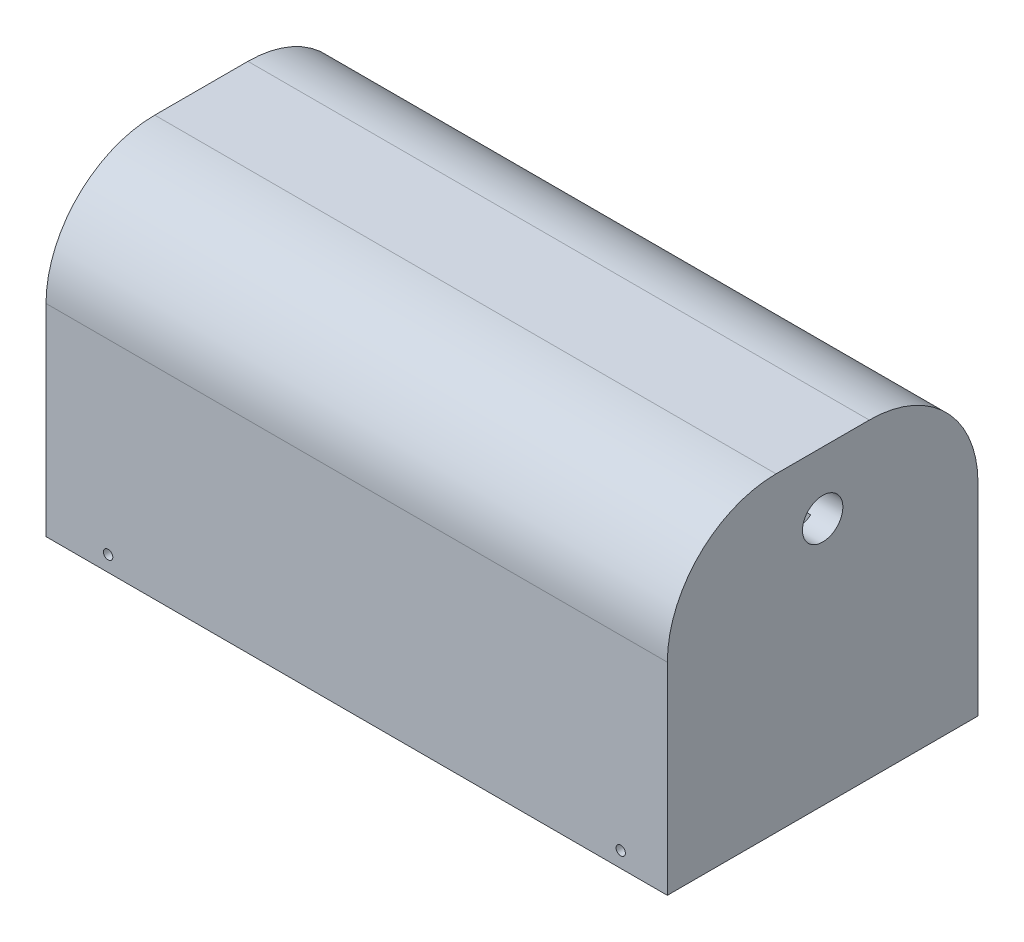
ISO-10303-21;
HEADER;
FILE_DESCRIPTION(('STEP AP214'),'2;1');
FILE_NAME('part.step','',(''),(''),'','','');
FILE_SCHEMA(('AUTOMOTIVE_DESIGN { 1 0 10303 214 1 1 1 1 }'));
ENDSEC;
DATA;
#1=APPLICATION_CONTEXT('core data for automotive mechanical design processes');
#2=APPLICATION_PROTOCOL_DEFINITION('international standard','automotive_design',2000,#1);
#3=PRODUCT_CONTEXT('',#1,'mechanical');
#4=PRODUCT('Part','Part','',(#3));
#5=PRODUCT_RELATED_PRODUCT_CATEGORY('part','',(#4));
#6=PRODUCT_DEFINITION_FORMATION('','',#4);
#7=PRODUCT_DEFINITION_CONTEXT('part definition',#1,'design');
#8=PRODUCT_DEFINITION('design','',#6,#7);
#9=PRODUCT_DEFINITION_SHAPE('','',#8);
#10=(LENGTH_UNIT() NAMED_UNIT(*) SI_UNIT(.MILLI.,.METRE.));
#11=(NAMED_UNIT(*) PLANE_ANGLE_UNIT() SI_UNIT($,.RADIAN.));
#12=(NAMED_UNIT(*) SI_UNIT($,.STERADIAN.) SOLID_ANGLE_UNIT());
#13=UNCERTAINTY_MEASURE_WITH_UNIT(LENGTH_MEASURE(1.E-05),#10,'distance_accuracy_value','');
#14=(GEOMETRIC_REPRESENTATION_CONTEXT(3) GLOBAL_UNCERTAINTY_ASSIGNED_CONTEXT((#13)) GLOBAL_UNIT_ASSIGNED_CONTEXT((#10,
#11,#12)) REPRESENTATION_CONTEXT('',''));
#15=CARTESIAN_POINT('',(0.,0.,0.));
#16=DIRECTION('',(0.,0.,1.));
#17=DIRECTION('',(1.,0.,0.));
#18=AXIS2_PLACEMENT_3D('',#15,#16,#17);
#19=CARTESIAN_POINT('',(92.,25.,8.));
#20=DIRECTION('',(1.,0.,0.));
#21=DIRECTION('',(0.,1.,0.));
#22=AXIS2_PLACEMENT_3D('',#19,#20,#21);
#23=PLANE('',#22);
#24=DIRECTION('',(0.,0.,-1.));
#25=VECTOR('',#24,1.);
#26=CARTESIAN_POINT('',(92.,-42.,8.));
#27=LINE('',#26,#25);
#28=CARTESIAN_POINT('',(92.,-42.,92.));
#29=VERTEX_POINT('',#28);
#30=CARTESIAN_POINT('',(92.,-42.,8.));
#31=VERTEX_POINT('',#30);
#32=EDGE_CURVE('E200',#29,#31,#27,.T.);
#33=ORIENTED_EDGE('',*,*,#32,.F.);
#34=DIRECTION('',(0.,-1.,0.));
#35=VECTOR('',#34,1.);
#36=CARTESIAN_POINT('',(92.,25.,92.));
#37=LINE('',#36,#35);
#38=CARTESIAN_POINT('',(92.,25.,92.));
#39=VERTEX_POINT('',#38);
#40=EDGE_CURVE('E227',#39,#29,#37,.T.);
#41=ORIENTED_EDGE('',*,*,#40,.F.);
#42=DIRECTION('',(0.,0.,1.));
#43=VECTOR('',#42,1.);
#44=CARTESIAN_POINT('',(92.,25.,8.));
#45=LINE('',#44,#43);
#46=CARTESIAN_POINT('',(92.,25.,54.153311931459));
#47=VERTEX_POINT('',#46);
#48=EDGE_CURVE('E214',#47,#39,#45,.T.);
#49=ORIENTED_EDGE('',*,*,#48,.F.);
#50=CARTESIAN_POINT('',(92.,30.,50.));
#51=DIRECTION('',(1.,0.,0.));
#52=DIRECTION('',(0.,1.,0.));
#53=AXIS2_PLACEMENT_3D('',#50,#51,#52);
#54=CIRCLE('',#53,6.5);
#55=CARTESIAN_POINT('',(92.,25.,45.846688068541));
#56=VERTEX_POINT('',#55);
#57=EDGE_CURVE('E286',#56,#47,#54,.F.);
#58=ORIENTED_EDGE('',*,*,#57,.F.);
#59=CARTESIAN_POINT('',(92.,25.,8.));
#60=VERTEX_POINT('',#59);
#61=EDGE_CURVE('E215',#60,#56,#45,.T.);
#62=ORIENTED_EDGE('',*,*,#61,.F.);
#63=DIRECTION('',(0.,-1.,0.));
#64=VECTOR('',#63,1.);
#65=CARTESIAN_POINT('',(92.,25.,8.));
#66=LINE('',#65,#64);
#67=EDGE_CURVE('E228',#60,#31,#66,.T.);
#68=ORIENTED_EDGE('',*,*,#67,.T.);
#69=EDGE_LOOP('',(#33,#41,#49,#58,#62,#68));
#70=FACE_BOUND('',#69,.T.);
#71=ADVANCED_FACE('F37',(#70),#23,.F.);
#72=CARTESIAN_POINT('',(-92.,25.,7.99999999999998));
#73=DIRECTION('',(-1.,0.,0.));
#74=DIRECTION('',(0.,-1.,0.));
#75=AXIS2_PLACEMENT_3D('',#72,#73,#74);
#76=PLANE('',#75);
#77=DIRECTION('',(0.,0.,1.));
#78=VECTOR('',#77,1.);
#79=CARTESIAN_POINT('',(-92.,-42.,7.99999999999998));
#80=LINE('',#79,#78);
#81=CARTESIAN_POINT('',(-92.,-42.,7.99999999999998));
#82=VERTEX_POINT('',#81);
#83=CARTESIAN_POINT('',(-92.,-42.,92.));
#84=VERTEX_POINT('',#83);
#85=EDGE_CURVE('E195',#82,#84,#80,.T.);
#86=ORIENTED_EDGE('',*,*,#85,.F.);
#87=DIRECTION('',(0.,-1.,0.));
#88=VECTOR('',#87,1.);
#89=CARTESIAN_POINT('',(-92.,25.,7.99999999999998));
#90=LINE('',#89,#88);
#91=CARTESIAN_POINT('',(-92.,25.,7.99999999999998));
#92=VERTEX_POINT('',#91);
#93=EDGE_CURVE('E232',#92,#82,#90,.T.);
#94=ORIENTED_EDGE('',*,*,#93,.F.);
#95=DIRECTION('',(0.,0.,-1.));
#96=VECTOR('',#95,1.);
#97=CARTESIAN_POINT('',(-92.,25.,7.99999999999998));
#98=LINE('',#97,#96);
#99=CARTESIAN_POINT('',(-92.,25.,45.846688068541));
#100=VERTEX_POINT('',#99);
#101=EDGE_CURVE('E221',#100,#92,#98,.T.);
#102=ORIENTED_EDGE('',*,*,#101,.F.);
#103=CARTESIAN_POINT('',(-92.,30.,50.));
#104=DIRECTION('',(-1.,0.,0.));
#105=DIRECTION('',(0.,-1.,0.));
#106=AXIS2_PLACEMENT_3D('',#103,#104,#105);
#107=CIRCLE('',#106,6.5);
#108=CARTESIAN_POINT('',(-92.,25.,54.153311931459));
#109=VERTEX_POINT('',#108);
#110=EDGE_CURVE('E283',#109,#100,#107,.F.);
#111=ORIENTED_EDGE('',*,*,#110,.F.);
#112=CARTESIAN_POINT('',(-92.,25.,92.));
#113=VERTEX_POINT('',#112);
#114=EDGE_CURVE('E222',#113,#109,#98,.T.);
#115=ORIENTED_EDGE('',*,*,#114,.F.);
#116=DIRECTION('',(0.,-1.,0.));
#117=VECTOR('',#116,1.);
#118=CARTESIAN_POINT('',(-92.,25.,92.));
#119=LINE('',#118,#117);
#120=EDGE_CURVE('E235',#113,#84,#119,.T.);
#121=ORIENTED_EDGE('',*,*,#120,.T.);
#122=EDGE_LOOP('',(#86,#94,#102,#111,#115,#121));
#123=FACE_BOUND('',#122,.T.);
#124=ADVANCED_FACE('F334',(#123),#76,.F.);
#125=CARTESIAN_POINT('',(92.,25.,8.));
#126=DIRECTION('',(0.,0.,-1.));
#127=DIRECTION('',(-1.,0.,0.));
#128=AXIS2_PLACEMENT_3D('',#125,#126,#127);
#129=PLANE('',#128);
#130=DIRECTION('',(-1.,0.,0.));
#131=VECTOR('',#130,1.);
#132=CARTESIAN_POINT('',(92.,-42.,8.));
#133=LINE('',#132,#131);
#134=EDGE_CURVE('E202',#31,#82,#133,.T.);
#135=ORIENTED_EDGE('',*,*,#134,.F.);
#136=ORIENTED_EDGE('',*,*,#67,.F.);
#137=DIRECTION('',(1.,0.,0.));
#138=VECTOR('',#137,1.);
#139=CARTESIAN_POINT('',(92.,25.,8.));
#140=LINE('',#139,#138);
#141=EDGE_CURVE('E224',#92,#60,#140,.T.);
#142=ORIENTED_EDGE('',*,*,#141,.F.);
#143=ORIENTED_EDGE('',*,*,#93,.T.);
#144=EDGE_LOOP('',(#135,#136,#142,#143));
#145=FACE_BOUND('',#144,.T.);
#146=ADVANCED_FACE('F340',(#145),#129,.F.);
#147=CARTESIAN_POINT('',(92.,25.,92.));
#148=DIRECTION('',(0.,0.,1.));
#149=DIRECTION('',(1.,0.,0.));
#150=AXIS2_PLACEMENT_3D('',#147,#148,#149);
#151=PLANE('',#150);
#152=DIRECTION('',(1.,0.,0.));
#153=VECTOR('',#152,1.);
#154=CARTESIAN_POINT('',(92.,-42.,92.));
#155=LINE('',#154,#153);
#156=EDGE_CURVE('E291',#84,#29,#155,.T.);
#157=ORIENTED_EDGE('',*,*,#156,.F.);
#158=ORIENTED_EDGE('',*,*,#120,.F.);
#159=DIRECTION('',(-1.,0.,0.));
#160=VECTOR('',#159,1.);
#161=CARTESIAN_POINT('',(92.,25.,92.));
#162=LINE('',#161,#160);
#163=EDGE_CURVE('E218',#39,#113,#162,.T.);
#164=ORIENTED_EDGE('',*,*,#163,.F.);
#165=ORIENTED_EDGE('',*,*,#40,.T.);
#166=EDGE_LOOP('',(#157,#158,#164,#165));
#167=FACE_BOUND('',#166,.T.);
#168=ADVANCED_FACE('F346',(#167),#151,.F.);
#169=CARTESIAN_POINT('',(-100.,30.,50.));
#170=DIRECTION('',(1.,0.,0.));
#171=DIRECTION('',(0.,0.,-1.));
#172=AXIS2_PLACEMENT_3D('',#169,#170,#171);
#173=CYLINDRICAL_SURFACE('',#172,6.5);
#174=CARTESIAN_POINT('',(100.,30.,50.));
#175=DIRECTION('',(1.,0.,0.));
#176=DIRECTION('',(0.,0.,-1.));
#177=AXIS2_PLACEMENT_3D('',#174,#175,#176);
#178=CIRCLE('',#177,6.5);
#179=CARTESIAN_POINT('',(100.,30.,43.5));
#180=VERTEX_POINT('',#179);
#181=EDGE_CURVE('E243',#180,#180,#178,.T.);
#182=ORIENTED_EDGE('',*,*,#181,.T.);
#183=EDGE_LOOP('',(#182));
#184=FACE_BOUND('',#183,.T.);
#185=CARTESIAN_POINT('',(-100.,30.,50.));
#186=DIRECTION('',(1.,0.,0.));
#187=DIRECTION('',(0.,0.,-1.));
#188=AXIS2_PLACEMENT_3D('',#185,#186,#187);
#189=CIRCLE('',#188,6.5);
#190=CARTESIAN_POINT('',(-100.,30.,43.5));
#191=VERTEX_POINT('',#190);
#192=EDGE_CURVE('E252',#191,#191,#189,.T.);
#193=ORIENTED_EDGE('',*,*,#192,.F.);
#194=EDGE_LOOP('',(#193));
#195=FACE_BOUND('',#194,.T.);
#196=DIRECTION('',(1.,0.,0.));
#197=VECTOR('',#196,1.);
#198=CARTESIAN_POINT('',(-100.,25.,45.846688068541));
#199=LINE('',#198,#197);
#200=EDGE_CURVE('E289',#56,#100,#199,.F.);
#201=ORIENTED_EDGE('',*,*,#200,.F.);
#202=ORIENTED_EDGE('',*,*,#57,.T.);
#203=DIRECTION('',(1.,0.,0.));
#204=VECTOR('',#203,1.);
#205=CARTESIAN_POINT('',(-100.,25.,54.153311931459));
#206=LINE('',#205,#204);
#207=EDGE_CURVE('E281',#109,#47,#206,.T.);
#208=ORIENTED_EDGE('',*,*,#207,.F.);
#209=ORIENTED_EDGE('',*,*,#110,.T.);
#210=EDGE_LOOP('',(#201,#202,#208,#209));
#211=FACE_BOUND('',#210,.T.);
#212=ADVANCED_FACE('F358',(#184,#195,#211),#173,.F.);
#213=CARTESIAN_POINT('',(-80.,-45.,0.));
#214=DIRECTION('',(0.,0.,1.));
#215=DIRECTION('',(1.,0.,0.));
#216=AXIS2_PLACEMENT_3D('',#213,#214,#215);
#217=CYLINDRICAL_SURFACE('',#216,1.5);
#218=CARTESIAN_POINT('',(-80.,-45.,3.99999999999998));
#219=DIRECTION('',(0.,0.,-1.));
#220=DIRECTION('',(-1.,0.,0.));
#221=AXIS2_PLACEMENT_3D('',#218,#219,#220);
#222=CIRCLE('',#221,1.5);
#223=CARTESIAN_POINT('',(-78.5,-45.,3.99999999999998));
#224=VERTEX_POINT('',#223);
#225=EDGE_CURVE('E211',#224,#224,#222,.F.);
#226=CARTESIAN_POINT('',(-80.,-45.,0.));
#227=DIRECTION('',(0.,0.,1.));
#228=DIRECTION('',(1.,0.,0.));
#229=AXIS2_PLACEMENT_3D('',#226,#227,#228);
#230=CIRCLE('',#229,1.5);
#231=CARTESIAN_POINT('',(-78.5,-45.,0.));
#232=VERTEX_POINT('',#231);
#233=EDGE_CURVE('E247',#232,#232,#230,.T.);
#234=CARTESIAN_POINT('',(-78.5,-45.,3.99999999999998));
#235=CARTESIAN_POINT('',(-78.5,-45.,3.95833333333331));
#236=CARTESIAN_POINT('',(-78.5,-45.,3.91666666666665));
#237=CARTESIAN_POINT('',(-78.5,-45.,3.83333333333331));
#238=CARTESIAN_POINT('',(-78.5,-45.,3.79166666666665));
#239=CARTESIAN_POINT('',(-78.5,-45.,3.70833333333331));
#240=CARTESIAN_POINT('',(-78.5,-45.,3.66666666666665));
#241=CARTESIAN_POINT('',(-78.5,-45.,3.58333333333331));
#242=CARTESIAN_POINT('',(-78.5,-45.,3.54166666666665));
#243=CARTESIAN_POINT('',(-78.5,-45.,3.45833333333331));
#244=CARTESIAN_POINT('',(-78.5,-45.,3.41666666666665));
#245=CARTESIAN_POINT('',(-78.5,-45.,3.33333333333332));
#246=CARTESIAN_POINT('',(-78.5,-45.,3.29166666666665));
#247=CARTESIAN_POINT('',(-78.5,-45.,3.20833333333332));
#248=CARTESIAN_POINT('',(-78.5,-45.,3.16666666666665));
#249=CARTESIAN_POINT('',(-78.5,-45.,3.08333333333332));
#250=CARTESIAN_POINT('',(-78.5,-45.,3.04166666666665));
#251=CARTESIAN_POINT('',(-78.5,-45.,2.95833333333332));
#252=CARTESIAN_POINT('',(-78.5,-45.,2.91666666666665));
#253=CARTESIAN_POINT('',(-78.5,-45.,2.83333333333332));
#254=CARTESIAN_POINT('',(-78.5,-45.,2.79166666666665));
#255=CARTESIAN_POINT('',(-78.5,-45.,2.70833333333332));
#256=CARTESIAN_POINT('',(-78.5,-45.,2.66666666666665));
#257=CARTESIAN_POINT('',(-78.5,-45.,2.58333333333332));
#258=CARTESIAN_POINT('',(-78.5,-45.,2.54166666666665));
#259=CARTESIAN_POINT('',(-78.5,-45.,2.45833333333332));
#260=CARTESIAN_POINT('',(-78.5,-45.,2.41666666666665));
#261=CARTESIAN_POINT('',(-78.5,-45.,2.33333333333332));
#262=CARTESIAN_POINT('',(-78.5,-45.,2.29166666666665));
#263=CARTESIAN_POINT('',(-78.5,-45.,2.20833333333332));
#264=CARTESIAN_POINT('',(-78.5,-45.,2.16666666666665));
#265=CARTESIAN_POINT('',(-78.5,-45.,2.08333333333332));
#266=CARTESIAN_POINT('',(-78.5,-45.,2.04166666666666));
#267=CARTESIAN_POINT('',(-78.5,-45.,1.95833333333332));
#268=CARTESIAN_POINT('',(-78.5,-45.,1.91666666666666));
#269=CARTESIAN_POINT('',(-78.5,-45.,1.83333333333332));
#270=CARTESIAN_POINT('',(-78.5,-45.,1.79166666666666));
#271=CARTESIAN_POINT('',(-78.5,-45.,1.70833333333332));
#272=CARTESIAN_POINT('',(-78.5,-45.,1.66666666666666));
#273=CARTESIAN_POINT('',(-78.5,-45.,1.58333333333332));
#274=CARTESIAN_POINT('',(-78.5,-45.,1.54166666666666));
#275=CARTESIAN_POINT('',(-78.5,-45.,1.45833333333333));
#276=CARTESIAN_POINT('',(-78.5,-45.,1.41666666666666));
#277=CARTESIAN_POINT('',(-78.5,-45.,1.33333333333333));
#278=CARTESIAN_POINT('',(-78.5,-45.,1.29166666666666));
#279=CARTESIAN_POINT('',(-78.5,-45.,1.20833333333333));
#280=CARTESIAN_POINT('',(-78.5,-45.,1.16666666666666));
#281=CARTESIAN_POINT('',(-78.5,-45.,1.08333333333333));
#282=CARTESIAN_POINT('',(-78.5,-45.,1.04166666666666));
#283=CARTESIAN_POINT('',(-78.5,-45.,0.958333333333328));
#284=CARTESIAN_POINT('',(-78.5,-45.,0.916666666666662));
#285=CARTESIAN_POINT('',(-78.5,-45.,0.833333333333329));
#286=CARTESIAN_POINT('',(-78.5,-45.,0.791666666666663));
#287=CARTESIAN_POINT('',(-78.5,-45.,0.70833333333333));
#288=CARTESIAN_POINT('',(-78.5,-45.,0.666666666666663));
#289=CARTESIAN_POINT('',(-78.5,-45.,0.58333333333333));
#290=CARTESIAN_POINT('',(-78.5,-45.,0.541666666666664));
#291=CARTESIAN_POINT('',(-78.5,-45.,0.458333333333331));
#292=CARTESIAN_POINT('',(-78.5,-45.,0.416666666666664));
#293=CARTESIAN_POINT('',(-78.5,-45.,0.333333333333332));
#294=CARTESIAN_POINT('',(-78.5,-45.,0.291666666666665));
#295=CARTESIAN_POINT('',(-78.5,-45.,0.208333333333332));
#296=CARTESIAN_POINT('',(-78.5,-45.,0.166666666666666));
#297=CARTESIAN_POINT('',(-78.5,-45.,0.0833333333333328));
#298=CARTESIAN_POINT('',(-78.5,-45.,0.0416666666666665));
#299=CARTESIAN_POINT('',(-78.5,-45.,0.));
#300=B_SPLINE_CURVE_WITH_KNOTS('',3,(#234,#235,#236,#237,#238,#239,#240,#241,#242,#243,#244,
#245,#246,#247,#248,#249,#250,#251,#252,#253,#254,#255,#256,#257,#258,#259,#260,#261,#262,#263,
#264,#265,#266,#267,#268,#269,#270,#271,#272,#273,#274,#275,#276,#277,#278,#279,#280,#281,#282,
#283,#284,#285,#286,#287,#288,#289,#290,#291,#292,#293,#294,#295,#296,#297,#298,#299),
.UNSPECIFIED.,.F.,.F.,(4,2,2,2,2,2,2,2,2,2,2,2,2,2,2,2,2,2,2,2,2,2,2,2,2,2,2,2,2,2,2,2,4),(0.,
0.124999999999999,0.249999999999998,0.374999999999998,0.499999999999997,0.624999999999996,
0.749999999999996,0.874999999999995,0.999999999999994,1.12499999999999,1.24999999999999,
1.37499999999999,1.49999999999999,1.62499999999999,1.74999999999999,1.87499999999999,
1.99999999999999,2.12499999999999,2.24999999999999,2.37499999999999,2.49999999999999,
2.62499999999999,2.74999999999998,2.87499999999998,2.99999999999998,3.12499999999998,
3.24999999999998,3.37499999999998,3.49999999999998,3.62499999999998,3.74999999999998,
3.87499999999998,3.99999999999998),.UNSPECIFIED.);
#301=EDGE_CURVE('BSEAM357',#224,#232,#300,.T.);
#302=ORIENTED_EDGE('',*,*,#225,.T.);
#303=ORIENTED_EDGE('',*,*,#233,.F.);
#304=ORIENTED_EDGE('',*,*,#301,.T.);
#305=ORIENTED_EDGE('',*,*,#301,.F.);
#306=EDGE_LOOP('',(#302,#304,#303,#305));
#307=FACE_BOUND('',#306,.T.);
#308=ADVANCED_FACE('F357',(#307),#217,.F.);
#309=CARTESIAN_POINT('',(85.,-45.,0.));
#310=DIRECTION('',(0.,0.,1.));
#311=DIRECTION('',(1.,0.,0.));
#312=AXIS2_PLACEMENT_3D('',#309,#310,#311);
#313=CYLINDRICAL_SURFACE('',#312,1.5);
#314=CARTESIAN_POINT('',(85.,-45.,4.));
#315=DIRECTION('',(0.,0.,-1.));
#316=DIRECTION('',(-1.,0.,0.));
#317=AXIS2_PLACEMENT_3D('',#314,#315,#316);
#318=CIRCLE('',#317,1.5);
#319=CARTESIAN_POINT('',(86.5,-45.,4.));
#320=VERTEX_POINT('',#319);
#321=EDGE_CURVE('E208',#320,#320,#318,.F.);
#322=CARTESIAN_POINT('',(85.,-45.,0.));
#323=DIRECTION('',(0.,0.,1.));
#324=DIRECTION('',(1.,0.,0.));
#325=AXIS2_PLACEMENT_3D('',#322,#323,#324);
#326=CIRCLE('',#325,1.5);
#327=CARTESIAN_POINT('',(86.5,-45.,0.));
#328=VERTEX_POINT('',#327);
#329=EDGE_CURVE('E240',#328,#328,#326,.T.);
#330=CARTESIAN_POINT('',(86.5,-45.,4.));
#331=CARTESIAN_POINT('',(86.5,-45.,3.95833333333333));
#332=CARTESIAN_POINT('',(86.5,-45.,3.91666666666667));
#333=CARTESIAN_POINT('',(86.5,-45.,3.83333333333333));
#334=CARTESIAN_POINT('',(86.5,-45.,3.79166666666667));
#335=CARTESIAN_POINT('',(86.5,-45.,3.70833333333333));
#336=CARTESIAN_POINT('',(86.5,-45.,3.66666666666667));
#337=CARTESIAN_POINT('',(86.5,-45.,3.58333333333333));
#338=CARTESIAN_POINT('',(86.5,-45.,3.54166666666667));
#339=CARTESIAN_POINT('',(86.5,-45.,3.45833333333333));
#340=CARTESIAN_POINT('',(86.5,-45.,3.41666666666667));
#341=CARTESIAN_POINT('',(86.5,-45.,3.33333333333333));
#342=CARTESIAN_POINT('',(86.5,-45.,3.29166666666667));
#343=CARTESIAN_POINT('',(86.5,-45.,3.20833333333333));
#344=CARTESIAN_POINT('',(86.5,-45.,3.16666666666667));
#345=CARTESIAN_POINT('',(86.5,-45.,3.08333333333333));
#346=CARTESIAN_POINT('',(86.5,-45.,3.04166666666667));
#347=CARTESIAN_POINT('',(86.5,-45.,2.95833333333333));
#348=CARTESIAN_POINT('',(86.5,-45.,2.91666666666667));
#349=CARTESIAN_POINT('',(86.5,-45.,2.83333333333333));
#350=CARTESIAN_POINT('',(86.5,-45.,2.79166666666667));
#351=CARTESIAN_POINT('',(86.5,-45.,2.70833333333333));
#352=CARTESIAN_POINT('',(86.5,-45.,2.66666666666667));
#353=CARTESIAN_POINT('',(86.5,-45.,2.58333333333333));
#354=CARTESIAN_POINT('',(86.5,-45.,2.54166666666667));
#355=CARTESIAN_POINT('',(86.5,-45.,2.45833333333333));
#356=CARTESIAN_POINT('',(86.5,-45.,2.41666666666667));
#357=CARTESIAN_POINT('',(86.5,-45.,2.33333333333333));
#358=CARTESIAN_POINT('',(86.5,-45.,2.29166666666667));
#359=CARTESIAN_POINT('',(86.5,-45.,2.20833333333333));
#360=CARTESIAN_POINT('',(86.5,-45.,2.16666666666667));
#361=CARTESIAN_POINT('',(86.5,-45.,2.08333333333333));
#362=CARTESIAN_POINT('',(86.5,-45.,2.04166666666667));
#363=CARTESIAN_POINT('',(86.5,-45.,1.95833333333333));
#364=CARTESIAN_POINT('',(86.5,-45.,1.91666666666667));
#365=CARTESIAN_POINT('',(86.5,-45.,1.83333333333333));
#366=CARTESIAN_POINT('',(86.5,-45.,1.79166666666667));
#367=CARTESIAN_POINT('',(86.5,-45.,1.70833333333333));
#368=CARTESIAN_POINT('',(86.5,-45.,1.66666666666667));
#369=CARTESIAN_POINT('',(86.5,-45.,1.58333333333333));
#370=CARTESIAN_POINT('',(86.5,-45.,1.54166666666667));
#371=CARTESIAN_POINT('',(86.5,-45.,1.45833333333333));
#372=CARTESIAN_POINT('',(86.5,-45.,1.41666666666667));
#373=CARTESIAN_POINT('',(86.5,-45.,1.33333333333333));
#374=CARTESIAN_POINT('',(86.5,-45.,1.29166666666667));
#375=CARTESIAN_POINT('',(86.5,-45.,1.20833333333333));
#376=CARTESIAN_POINT('',(86.5,-45.,1.16666666666667));
#377=CARTESIAN_POINT('',(86.5,-45.,1.08333333333333));
#378=CARTESIAN_POINT('',(86.5,-45.,1.04166666666667));
#379=CARTESIAN_POINT('',(86.5,-45.,0.958333333333333));
#380=CARTESIAN_POINT('',(86.5,-45.,0.916666666666666));
#381=CARTESIAN_POINT('',(86.5,-45.,0.833333333333333));
#382=CARTESIAN_POINT('',(86.5,-45.,0.791666666666666));
#383=CARTESIAN_POINT('',(86.5,-45.,0.708333333333333));
#384=CARTESIAN_POINT('',(86.5,-45.,0.666666666666667));
#385=CARTESIAN_POINT('',(86.5,-45.,0.583333333333333));
#386=CARTESIAN_POINT('',(86.5,-45.,0.541666666666667));
#387=CARTESIAN_POINT('',(86.5,-45.,0.458333333333333));
#388=CARTESIAN_POINT('',(86.5,-45.,0.416666666666667));
#389=CARTESIAN_POINT('',(86.5,-45.,0.333333333333333));
#390=CARTESIAN_POINT('',(86.5,-45.,0.291666666666667));
#391=CARTESIAN_POINT('',(86.5,-45.,0.208333333333333));
#392=CARTESIAN_POINT('',(86.5,-45.,0.166666666666667));
#393=CARTESIAN_POINT('',(86.5,-45.,0.0833333333333334));
#394=CARTESIAN_POINT('',(86.5,-45.,0.0416666666666667));
#395=CARTESIAN_POINT('',(86.5,-45.,0.));
#396=B_SPLINE_CURVE_WITH_KNOTS('',3,(#330,#331,#332,#333,#334,#335,#336,#337,#338,#339,#340,
#341,#342,#343,#344,#345,#346,#347,#348,#349,#350,#351,#352,#353,#354,#355,#356,#357,#358,#359,
#360,#361,#362,#363,#364,#365,#366,#367,#368,#369,#370,#371,#372,#373,#374,#375,#376,#377,#378,
#379,#380,#381,#382,#383,#384,#385,#386,#387,#388,#389,#390,#391,#392,#393,#394,#395),
.UNSPECIFIED.,.F.,.F.,(4,2,2,2,2,2,2,2,2,2,2,2,2,2,2,2,2,2,2,2,2,2,2,2,2,2,2,2,2,2,2,2,4),(0.,
0.125,0.25,0.374999999999999,0.5,0.625,0.749999999999999,0.874999999999999,1.,1.125,1.25,1.375,
1.5,1.625,1.75,1.875,2.,2.125,2.25,2.375,2.5,2.625,2.75,2.875,3.,3.125,3.25,3.375,3.5,3.625,
3.75,3.875,4.),.UNSPECIFIED.);
#397=EDGE_CURVE('BSEAM353',#320,#328,#396,.T.);
#398=ORIENTED_EDGE('',*,*,#321,.T.);
#399=ORIENTED_EDGE('',*,*,#329,.F.);
#400=ORIENTED_EDGE('',*,*,#397,.T.);
#401=ORIENTED_EDGE('',*,*,#397,.F.);
#402=EDGE_LOOP('',(#398,#400,#399,#401));
#403=FACE_BOUND('',#402,.T.);
#404=ADVANCED_FACE('F353',(#403),#313,.F.);
#405=CARTESIAN_POINT('',(-100.,-50.,100.));
#406=DIRECTION('',(1.,0.,0.));
#407=DIRECTION('',(0.,0.,-1.));
#408=AXIS2_PLACEMENT_3D('',#405,#406,#407);
#409=PLANE('',#408);
#410=ORIENTED_EDGE('',*,*,#192,.T.);
#411=EDGE_LOOP('',(#410));
#412=FACE_BOUND('',#411,.T.);
#413=DIRECTION('',(0.,0.,-1.));
#414=VECTOR('',#413,1.);
#415=CARTESIAN_POINT('',(-100.,50.,100.));
#416=LINE('',#415,#414);
#417=CARTESIAN_POINT('',(-100.,50.,65.));
#418=VERTEX_POINT('',#417);
#419=CARTESIAN_POINT('',(-100.,50.,35.));
#420=VERTEX_POINT('',#419);
#421=EDGE_CURVE('E265',#418,#420,#416,.T.);
#422=ORIENTED_EDGE('',*,*,#421,.T.);
#423=CARTESIAN_POINT('',(-100.,15.,35.));
#424=DIRECTION('',(1.,0.,0.));
#425=DIRECTION('',(0.,0.,-1.));
#426=AXIS2_PLACEMENT_3D('',#423,#424,#425);
#427=CIRCLE('',#426,35.);
#428=CARTESIAN_POINT('',(-100.,15.,0.));
#429=VERTEX_POINT('',#428);
#430=EDGE_CURVE('E302',#420,#429,#427,.F.);
#431=ORIENTED_EDGE('',*,*,#430,.T.);
#432=DIRECTION('',(0.,-1.,0.));
#433=VECTOR('',#432,1.);
#434=CARTESIAN_POINT('',(-100.,-50.,0.));
#435=LINE('',#434,#433);
#436=CARTESIAN_POINT('',(-100.,-50.,0.));
#437=VERTEX_POINT('',#436);
#438=EDGE_CURVE('E255',#429,#437,#435,.T.);
#439=ORIENTED_EDGE('',*,*,#438,.T.);
#440=DIRECTION('',(0.,0.,-1.));
#441=VECTOR('',#440,1.);
#442=CARTESIAN_POINT('',(-100.,-50.,100.));
#443=LINE('',#442,#441);
#444=CARTESIAN_POINT('',(-100.,-50.,100.));
#445=VERTEX_POINT('',#444);
#446=EDGE_CURVE('E278',#445,#437,#443,.T.);
#447=ORIENTED_EDGE('',*,*,#446,.F.);
#448=DIRECTION('',(0.,-1.,0.));
#449=VECTOR('',#448,1.);
#450=CARTESIAN_POINT('',(-100.,-50.,100.));
#451=LINE('',#450,#449);
#452=CARTESIAN_POINT('',(-100.,15.,100.));
#453=VERTEX_POINT('',#452);
#454=EDGE_CURVE('E258',#453,#445,#451,.T.);
#455=ORIENTED_EDGE('',*,*,#454,.F.);
#456=CARTESIAN_POINT('',(-100.,15.,65.));
#457=DIRECTION('',(1.,0.,0.));
#458=DIRECTION('',(0.,0.,-1.));
#459=AXIS2_PLACEMENT_3D('',#456,#457,#458);
#460=CIRCLE('',#459,35.);
#461=EDGE_CURVE('E300',#453,#418,#460,.F.);
#462=ORIENTED_EDGE('',*,*,#461,.T.);
#463=EDGE_LOOP('',(#422,#431,#439,#447,#455,#462));
#464=FACE_BOUND('',#463,.T.);
#465=ADVANCED_FACE('F315',(#412,#464),#409,.F.);
#466=CARTESIAN_POINT('',(100.,-50.,100.));
#467=DIRECTION('',(0.,1.,0.));
#468=DIRECTION('',(-1.,0.,0.));
#469=AXIS2_PLACEMENT_3D('',#466,#467,#468);
#470=PLANE('',#469);
#471=DIRECTION('',(-1.,0.,0.));
#472=VECTOR('',#471,1.);
#473=CARTESIAN_POINT('',(96.,-50.,96.));
#474=LINE('',#473,#472);
#475=CARTESIAN_POINT('',(96.,-50.,96.));
#476=VERTEX_POINT('',#475);
#477=CARTESIAN_POINT('',(-96.,-50.,96.));
#478=VERTEX_POINT('',#477);
#479=EDGE_CURVE('E189',#476,#478,#474,.T.);
#480=ORIENTED_EDGE('',*,*,#479,.F.);
#481=DIRECTION('',(0.,0.,1.));
#482=VECTOR('',#481,1.);
#483=CARTESIAN_POINT('',(96.,-50.,4.));
#484=LINE('',#483,#482);
#485=CARTESIAN_POINT('',(96.,-50.,4.));
#486=VERTEX_POINT('',#485);
#487=EDGE_CURVE('E161',#486,#476,#484,.T.);
#488=ORIENTED_EDGE('',*,*,#487,.F.);
#489=DIRECTION('',(1.,0.,0.));
#490=VECTOR('',#489,1.);
#491=CARTESIAN_POINT('',(96.,-50.,4.));
#492=LINE('',#491,#490);
#493=CARTESIAN_POINT('',(-96.,-50.,3.99999999999998));
#494=VERTEX_POINT('',#493);
#495=EDGE_CURVE('E180',#494,#486,#492,.T.);
#496=ORIENTED_EDGE('',*,*,#495,.F.);
#497=DIRECTION('',(0.,0.,-1.));
#498=VECTOR('',#497,1.);
#499=CARTESIAN_POINT('',(-96.,-50.,3.99999999999998));
#500=LINE('',#499,#498);
#501=EDGE_CURVE('E183',#478,#494,#500,.T.);
#502=ORIENTED_EDGE('',*,*,#501,.F.);
#503=EDGE_LOOP('',(#480,#488,#496,#502));
#504=FACE_BOUND('',#503,.T.);
#505=DIRECTION('',(1.,0.,0.));
#506=VECTOR('',#505,1.);
#507=CARTESIAN_POINT('',(100.,-50.,0.));
#508=LINE('',#507,#506);
#509=CARTESIAN_POINT('',(100.,-50.,0.));
#510=VERTEX_POINT('',#509);
#511=EDGE_CURVE('E267',#437,#510,#508,.T.);
#512=ORIENTED_EDGE('',*,*,#511,.T.);
#513=DIRECTION('',(0.,0.,-1.));
#514=VECTOR('',#513,1.);
#515=CARTESIAN_POINT('',(100.,-50.,100.));
#516=LINE('',#515,#514);
#517=CARTESIAN_POINT('',(100.,-50.,100.));
#518=VERTEX_POINT('',#517);
#519=EDGE_CURVE('E275',#518,#510,#516,.T.);
#520=ORIENTED_EDGE('',*,*,#519,.F.);
#521=DIRECTION('',(1.,0.,0.));
#522=VECTOR('',#521,1.);
#523=CARTESIAN_POINT('',(100.,-50.,100.));
#524=LINE('',#523,#522);
#525=EDGE_CURVE('E260',#445,#518,#524,.T.);
#526=ORIENTED_EDGE('',*,*,#525,.F.);
#527=ORIENTED_EDGE('',*,*,#446,.T.);
#528=EDGE_LOOP('',(#512,#520,#526,#527));
#529=FACE_BOUND('',#528,.T.);
#530=ADVANCED_FACE('F322',(#504,#529),#470,.F.);
#531=CARTESIAN_POINT('',(100.,-50.,100.));
#532=DIRECTION('',(-1.,0.,0.));
#533=DIRECTION('',(0.,0.,1.));
#534=AXIS2_PLACEMENT_3D('',#531,#532,#533);
#535=PLANE('',#534);
#536=ORIENTED_EDGE('',*,*,#181,.F.);
#537=EDGE_LOOP('',(#536));
#538=FACE_BOUND('',#537,.T.);
#539=DIRECTION('',(0.,1.,0.));
#540=VECTOR('',#539,1.);
#541=CARTESIAN_POINT('',(100.,-50.,0.));
#542=LINE('',#541,#540);
#543=CARTESIAN_POINT('',(100.,15.,0.));
#544=VERTEX_POINT('',#543);
#545=EDGE_CURVE('E261',#510,#544,#542,.T.);
#546=ORIENTED_EDGE('',*,*,#545,.T.);
#547=CARTESIAN_POINT('',(100.,15.,35.));
#548=DIRECTION('',(-1.,0.,0.));
#549=DIRECTION('',(0.,0.,1.));
#550=AXIS2_PLACEMENT_3D('',#547,#548,#549);
#551=CIRCLE('',#550,35.);
#552=CARTESIAN_POINT('',(100.,50.,35.));
#553=VERTEX_POINT('',#552);
#554=EDGE_CURVE('E45',#544,#553,#551,.F.);
#555=ORIENTED_EDGE('',*,*,#554,.T.);
#556=DIRECTION('',(0.,0.,-1.));
#557=VECTOR('',#556,1.);
#558=CARTESIAN_POINT('',(100.,50.,100.));
#559=LINE('',#558,#557);
#560=CARTESIAN_POINT('',(100.,50.,65.));
#561=VERTEX_POINT('',#560);
#562=EDGE_CURVE('E272',#561,#553,#559,.T.);
#563=ORIENTED_EDGE('',*,*,#562,.F.);
#564=CARTESIAN_POINT('',(100.,15.,65.));
#565=DIRECTION('',(-1.,0.,0.));
#566=DIRECTION('',(0.,0.,1.));
#567=AXIS2_PLACEMENT_3D('',#564,#565,#566);
#568=CIRCLE('',#567,35.);
#569=CARTESIAN_POINT('',(100.,15.,100.));
#570=VERTEX_POINT('',#569);
#571=EDGE_CURVE('E52',#561,#570,#568,.F.);
#572=ORIENTED_EDGE('',*,*,#571,.T.);
#573=DIRECTION('',(0.,1.,0.));
#574=VECTOR('',#573,1.);
#575=CARTESIAN_POINT('',(100.,-50.,100.));
#576=LINE('',#575,#574);
#577=EDGE_CURVE('E263',#518,#570,#576,.T.);
#578=ORIENTED_EDGE('',*,*,#577,.F.);
#579=ORIENTED_EDGE('',*,*,#519,.T.);
#580=EDGE_LOOP('',(#546,#555,#563,#572,#578,#579));
#581=FACE_BOUND('',#580,.T.);
#582=ADVANCED_FACE('F306',(#538,#581),#535,.F.);
#583=CARTESIAN_POINT('',(100.,50.,100.));
#584=DIRECTION('',(0.,-1.,0.));
#585=DIRECTION('',(1.,0.,0.));
#586=AXIS2_PLACEMENT_3D('',#583,#584,#585);
#587=PLANE('',#586);
#588=ORIENTED_EDGE('',*,*,#562,.T.);
#589=DIRECTION('',(-1.,0.,0.));
#590=VECTOR('',#589,1.);
#591=CARTESIAN_POINT('',(100.,50.,35.));
#592=LINE('',#591,#590);
#593=EDGE_CURVE('E297',#553,#420,#592,.T.);
#594=ORIENTED_EDGE('',*,*,#593,.T.);
#595=ORIENTED_EDGE('',*,*,#421,.F.);
#596=DIRECTION('',(-1.,0.,0.));
#597=VECTOR('',#596,1.);
#598=CARTESIAN_POINT('',(100.,50.,65.));
#599=LINE('',#598,#597);
#600=EDGE_CURVE('E293',#418,#561,#599,.F.);
#601=ORIENTED_EDGE('',*,*,#600,.T.);
#602=EDGE_LOOP('',(#588,#594,#595,#601));
#603=FACE_BOUND('',#602,.T.);
#604=ADVANCED_FACE('F310',(#603),#587,.F.);
#605=CARTESIAN_POINT('',(0.,0.,100.));
#606=DIRECTION('',(0.,0.,1.));
#607=DIRECTION('',(1.,0.,0.));
#608=AXIS2_PLACEMENT_3D('',#605,#606,#607);
#609=PLANE('',#608);
#610=CARTESIAN_POINT('',(85.,-45.,100.));
#611=DIRECTION('',(0.,0.,1.));
#612=DIRECTION('',(1.,0.,0.));
#613=AXIS2_PLACEMENT_3D('',#610,#611,#612);
#614=CIRCLE('',#613,1.5);
#615=CARTESIAN_POINT('',(86.5,-45.,100.));
#616=VERTEX_POINT('',#615);
#617=EDGE_CURVE('E244',#616,#616,#614,.T.);
#618=ORIENTED_EDGE('',*,*,#617,.F.);
#619=EDGE_LOOP('',(#618));
#620=FACE_BOUND('',#619,.T.);
#621=CARTESIAN_POINT('',(-80.,-45.,100.));
#622=DIRECTION('',(0.,0.,1.));
#623=DIRECTION('',(1.,0.,0.));
#624=AXIS2_PLACEMENT_3D('',#621,#622,#623);
#625=CIRCLE('',#624,1.5);
#626=CARTESIAN_POINT('',(-78.5,-45.,100.));
#627=VERTEX_POINT('',#626);
#628=EDGE_CURVE('E231',#627,#627,#625,.T.);
#629=ORIENTED_EDGE('',*,*,#628,.F.);
#630=EDGE_LOOP('',(#629));
#631=FACE_BOUND('',#630,.T.);
#632=ORIENTED_EDGE('',*,*,#577,.T.);
#633=DIRECTION('',(-1.,0.,0.));
#634=VECTOR('',#633,1.);
#635=CARTESIAN_POINT('',(-100.,15.,100.));
#636=LINE('',#635,#634);
#637=EDGE_CURVE('E11',#570,#453,#636,.T.);
#638=ORIENTED_EDGE('',*,*,#637,.T.);
#639=ORIENTED_EDGE('',*,*,#454,.T.);
#640=ORIENTED_EDGE('',*,*,#525,.T.);
#641=EDGE_LOOP('',(#632,#638,#639,#640));
#642=FACE_BOUND('',#641,.T.);
#643=ADVANCED_FACE('F325',(#620,#631,#642),#609,.T.);
#644=CARTESIAN_POINT('',(0.,0.,0.));
#645=DIRECTION('',(0.,0.,1.));
#646=DIRECTION('',(1.,0.,0.));
#647=AXIS2_PLACEMENT_3D('',#644,#645,#646);
#648=PLANE('',#647);
#649=ORIENTED_EDGE('',*,*,#329,.T.);
#650=EDGE_LOOP('',(#649));
#651=FACE_BOUND('',#650,.T.);
#652=ORIENTED_EDGE('',*,*,#233,.T.);
#653=EDGE_LOOP('',(#652));
#654=FACE_BOUND('',#653,.T.);
#655=ORIENTED_EDGE('',*,*,#438,.F.);
#656=DIRECTION('',(-1.,0.,0.));
#657=VECTOR('',#656,1.);
#658=CARTESIAN_POINT('',(0.,15.,0.));
#659=LINE('',#658,#657);
#660=EDGE_CURVE('E60',#429,#544,#659,.F.);
#661=ORIENTED_EDGE('',*,*,#660,.T.);
#662=ORIENTED_EDGE('',*,*,#545,.F.);
#663=ORIENTED_EDGE('',*,*,#511,.F.);
#664=EDGE_LOOP('',(#655,#661,#662,#663));
#665=FACE_BOUND('',#664,.T.);
#666=ADVANCED_FACE('F318',(#651,#654,#665),#648,.F.);
#667=CARTESIAN_POINT('',(-80.,-45.,96.));
#668=DIRECTION('',(0.,0.,1.));
#669=DIRECTION('',(1.,0.,0.));
#670=AXIS2_PLACEMENT_3D('',#667,#668,#669);
#671=CIRCLE('',#670,1.5);
#672=CARTESIAN_POINT('',(-78.5,-45.,96.));
#673=VERTEX_POINT('',#672);
#674=EDGE_CURVE('E205',#673,#673,#671,.F.);
#675=CARTESIAN_POINT('',(-78.5,-45.,96.));
#676=CARTESIAN_POINT('',(-78.5,-45.,96.0416666666666));
#677=CARTESIAN_POINT('',(-78.5,-45.,96.0833333333333));
#678=CARTESIAN_POINT('',(-78.5,-45.,96.1666666666666));
#679=CARTESIAN_POINT('',(-78.5,-45.,96.2083333333333));
#680=CARTESIAN_POINT('',(-78.5,-45.,96.2916666666666));
#681=CARTESIAN_POINT('',(-78.5,-45.,96.3333333333333));
#682=CARTESIAN_POINT('',(-78.5,-45.,96.4166666666666));
#683=CARTESIAN_POINT('',(-78.5,-45.,96.4583333333333));
#684=CARTESIAN_POINT('',(-78.5,-45.,96.5416666666666));
#685=CARTESIAN_POINT('',(-78.5,-45.,96.5833333333333));
#686=CARTESIAN_POINT('',(-78.5,-45.,96.6666666666666));
#687=CARTESIAN_POINT('',(-78.5,-45.,96.7083333333333));
#688=CARTESIAN_POINT('',(-78.5,-45.,96.7916666666666));
#689=CARTESIAN_POINT('',(-78.5,-45.,96.8333333333333));
#690=CARTESIAN_POINT('',(-78.5,-45.,96.9166666666666));
#691=CARTESIAN_POINT('',(-78.5,-45.,96.9583333333333));
#692=CARTESIAN_POINT('',(-78.5,-45.,97.0416666666666));
#693=CARTESIAN_POINT('',(-78.5,-45.,97.0833333333333));
#694=CARTESIAN_POINT('',(-78.5,-45.,97.1666666666666));
#695=CARTESIAN_POINT('',(-78.5,-45.,97.2083333333333));
#696=CARTESIAN_POINT('',(-78.5,-45.,97.2916666666666));
#697=CARTESIAN_POINT('',(-78.5,-45.,97.3333333333333));
#698=CARTESIAN_POINT('',(-78.5,-45.,97.4166666666666));
#699=CARTESIAN_POINT('',(-78.5,-45.,97.4583333333333));
#700=CARTESIAN_POINT('',(-78.5,-45.,97.5416666666666));
#701=CARTESIAN_POINT('',(-78.5,-45.,97.5833333333333));
#702=CARTESIAN_POINT('',(-78.5,-45.,97.6666666666666));
#703=CARTESIAN_POINT('',(-78.5,-45.,97.7083333333333));
#704=CARTESIAN_POINT('',(-78.5,-45.,97.7916666666666));
#705=CARTESIAN_POINT('',(-78.5,-45.,97.8333333333333));
#706=CARTESIAN_POINT('',(-78.5,-45.,97.9166666666666));
#707=CARTESIAN_POINT('',(-78.5,-45.,97.9583333333333));
#708=CARTESIAN_POINT('',(-78.5,-45.,98.0416666666666));
#709=CARTESIAN_POINT('',(-78.5,-45.,98.0833333333333));
#710=CARTESIAN_POINT('',(-78.5,-45.,98.1666666666666));
#711=CARTESIAN_POINT('',(-78.5,-45.,98.2083333333333));
#712=CARTESIAN_POINT('',(-78.5,-45.,98.2916666666666));
#713=CARTESIAN_POINT('',(-78.5,-45.,98.3333333333333));
#714=CARTESIAN_POINT('',(-78.5,-45.,98.4166666666666));
#715=CARTESIAN_POINT('',(-78.5,-45.,98.4583333333333));
#716=CARTESIAN_POINT('',(-78.5,-45.,98.5416666666666));
#717=CARTESIAN_POINT('',(-78.5,-45.,98.5833333333333));
#718=CARTESIAN_POINT('',(-78.5,-45.,98.6666666666666));
#719=CARTESIAN_POINT('',(-78.5,-45.,98.7083333333333));
#720=CARTESIAN_POINT('',(-78.5,-45.,98.7916666666666));
#721=CARTESIAN_POINT('',(-78.5,-45.,98.8333333333333));
#722=CARTESIAN_POINT('',(-78.5,-45.,98.9166666666667));
#723=CARTESIAN_POINT('',(-78.5,-45.,98.9583333333333));
#724=CARTESIAN_POINT('',(-78.5,-45.,99.0416666666667));
#725=CARTESIAN_POINT('',(-78.5,-45.,99.0833333333333));
#726=CARTESIAN_POINT('',(-78.5,-45.,99.1666666666667));
#727=CARTESIAN_POINT('',(-78.5,-45.,99.2083333333333));
#728=CARTESIAN_POINT('',(-78.5,-45.,99.2916666666667));
#729=CARTESIAN_POINT('',(-78.5,-45.,99.3333333333333));
#730=CARTESIAN_POINT('',(-78.5,-45.,99.4166666666667));
#731=CARTESIAN_POINT('',(-78.5,-45.,99.4583333333333));
#732=CARTESIAN_POINT('',(-78.5,-45.,99.5416666666667));
#733=CARTESIAN_POINT('',(-78.5,-45.,99.5833333333333));
#734=CARTESIAN_POINT('',(-78.5,-45.,99.6666666666667));
#735=CARTESIAN_POINT('',(-78.5,-45.,99.7083333333333));
#736=CARTESIAN_POINT('',(-78.5,-45.,99.7916666666667));
#737=CARTESIAN_POINT('',(-78.5,-45.,99.8333333333333));
#738=CARTESIAN_POINT('',(-78.5,-45.,99.9166666666667));
#739=CARTESIAN_POINT('',(-78.5,-45.,99.9583333333333));
#740=CARTESIAN_POINT('',(-78.5,-45.,100.));
#741=B_SPLINE_CURVE_WITH_KNOTS('',3,(#675,#676,#677,#678,#679,#680,#681,#682,#683,#684,#685,
#686,#687,#688,#689,#690,#691,#692,#693,#694,#695,#696,#697,#698,#699,#700,#701,#702,#703,#704,
#705,#706,#707,#708,#709,#710,#711,#712,#713,#714,#715,#716,#717,#718,#719,#720,#721,#722,#723,
#724,#725,#726,#727,#728,#729,#730,#731,#732,#733,#734,#735,#736,#737,#738,#739,#740),
.UNSPECIFIED.,.F.,.F.,(4,2,2,2,2,2,2,2,2,2,2,2,2,2,2,2,2,2,2,2,2,2,2,2,2,2,2,2,2,2,2,2,4),(0.,
0.125,0.25,0.375,0.5,0.625000000000001,0.750000000000001,0.875000000000001,1.,1.12500000000001,
1.25000000000002,1.37500000000002,1.50000000000002,1.62500000000002,1.75000000000002,
1.87500000000002,2.00000000000002,2.12500000000002,2.25000000000002,2.37500000000002,
2.50000000000002,2.62500000000002,2.75000000000002,2.87500000000002,3.00000000000003,
3.12500000000003,3.25000000000003,3.37500000000003,3.50000000000003,3.62500000000003,
3.75000000000003,3.87500000000003,4.00000000000003),.UNSPECIFIED.);
#742=EDGE_CURVE('BSEAM351',#673,#627,#741,.T.);
#743=ORIENTED_EDGE('',*,*,#674,.T.);
#744=ORIENTED_EDGE('',*,*,#628,.T.);
#745=ORIENTED_EDGE('',*,*,#742,.T.);
#746=ORIENTED_EDGE('',*,*,#742,.F.);
#747=EDGE_LOOP('',(#743,#745,#744,#746));
#748=FACE_BOUND('',#747,.T.);
#749=ADVANCED_FACE('F351',(#748),#217,.F.);
#750=CARTESIAN_POINT('',(85.,-45.,96.));
#751=DIRECTION('',(0.,0.,1.));
#752=DIRECTION('',(1.,0.,0.));
#753=AXIS2_PLACEMENT_3D('',#750,#751,#752);
#754=CIRCLE('',#753,1.5);
#755=CARTESIAN_POINT('',(86.5,-45.,96.));
#756=VERTEX_POINT('',#755);
#757=EDGE_CURVE('E204',#756,#756,#754,.F.);
#758=CARTESIAN_POINT('',(86.5,-45.,96.));
#759=CARTESIAN_POINT('',(86.5,-45.,96.0416666666667));
#760=CARTESIAN_POINT('',(86.5,-45.,96.0833333333333));
#761=CARTESIAN_POINT('',(86.5,-45.,96.1666666666667));
#762=CARTESIAN_POINT('',(86.5,-45.,96.2083333333333));
#763=CARTESIAN_POINT('',(86.5,-45.,96.2916666666667));
#764=CARTESIAN_POINT('',(86.5,-45.,96.3333333333333));
#765=CARTESIAN_POINT('',(86.5,-45.,96.4166666666667));
#766=CARTESIAN_POINT('',(86.5,-45.,96.4583333333333));
#767=CARTESIAN_POINT('',(86.5,-45.,96.5416666666667));
#768=CARTESIAN_POINT('',(86.5,-45.,96.5833333333333));
#769=CARTESIAN_POINT('',(86.5,-45.,96.6666666666667));
#770=CARTESIAN_POINT('',(86.5,-45.,96.7083333333333));
#771=CARTESIAN_POINT('',(86.5,-45.,96.7916666666667));
#772=CARTESIAN_POINT('',(86.5,-45.,96.8333333333333));
#773=CARTESIAN_POINT('',(86.5,-45.,96.9166666666667));
#774=CARTESIAN_POINT('',(86.5,-45.,96.9583333333333));
#775=CARTESIAN_POINT('',(86.5,-45.,97.0416666666667));
#776=CARTESIAN_POINT('',(86.5,-45.,97.0833333333333));
#777=CARTESIAN_POINT('',(86.5,-45.,97.1666666666667));
#778=CARTESIAN_POINT('',(86.5,-45.,97.2083333333333));
#779=CARTESIAN_POINT('',(86.5,-45.,97.2916666666667));
#780=CARTESIAN_POINT('',(86.5,-45.,97.3333333333333));
#781=CARTESIAN_POINT('',(86.5,-45.,97.4166666666667));
#782=CARTESIAN_POINT('',(86.5,-45.,97.4583333333333));
#783=CARTESIAN_POINT('',(86.5,-45.,97.5416666666667));
#784=CARTESIAN_POINT('',(86.5,-45.,97.5833333333333));
#785=CARTESIAN_POINT('',(86.5,-45.,97.6666666666667));
#786=CARTESIAN_POINT('',(86.5,-45.,97.7083333333333));
#787=CARTESIAN_POINT('',(86.5,-45.,97.7916666666667));
#788=CARTESIAN_POINT('',(86.5,-45.,97.8333333333333));
#789=CARTESIAN_POINT('',(86.5,-45.,97.9166666666667));
#790=CARTESIAN_POINT('',(86.5,-45.,97.9583333333333));
#791=CARTESIAN_POINT('',(86.5,-45.,98.0416666666667));
#792=CARTESIAN_POINT('',(86.5,-45.,98.0833333333333));
#793=CARTESIAN_POINT('',(86.5,-45.,98.1666666666667));
#794=CARTESIAN_POINT('',(86.5,-45.,98.2083333333333));
#795=CARTESIAN_POINT('',(86.5,-45.,98.2916666666667));
#796=CARTESIAN_POINT('',(86.5,-45.,98.3333333333333));
#797=CARTESIAN_POINT('',(86.5,-45.,98.4166666666667));
#798=CARTESIAN_POINT('',(86.5,-45.,98.4583333333333));
#799=CARTESIAN_POINT('',(86.5,-45.,98.5416666666667));
#800=CARTESIAN_POINT('',(86.5,-45.,98.5833333333333));
#801=CARTESIAN_POINT('',(86.5,-45.,98.6666666666667));
#802=CARTESIAN_POINT('',(86.5,-45.,98.7083333333333));
#803=CARTESIAN_POINT('',(86.5,-45.,98.7916666666667));
#804=CARTESIAN_POINT('',(86.5,-45.,98.8333333333333));
#805=CARTESIAN_POINT('',(86.5,-45.,98.9166666666667));
#806=CARTESIAN_POINT('',(86.5,-45.,98.9583333333333));
#807=CARTESIAN_POINT('',(86.5,-45.,99.0416666666667));
#808=CARTESIAN_POINT('',(86.5,-45.,99.0833333333333));
#809=CARTESIAN_POINT('',(86.5,-45.,99.1666666666667));
#810=CARTESIAN_POINT('',(86.5,-45.,99.2083333333333));
#811=CARTESIAN_POINT('',(86.5,-45.,99.2916666666667));
#812=CARTESIAN_POINT('',(86.5,-45.,99.3333333333333));
#813=CARTESIAN_POINT('',(86.5,-45.,99.4166666666667));
#814=CARTESIAN_POINT('',(86.5,-45.,99.4583333333333));
#815=CARTESIAN_POINT('',(86.5,-45.,99.5416666666667));
#816=CARTESIAN_POINT('',(86.5,-45.,99.5833333333333));
#817=CARTESIAN_POINT('',(86.5,-45.,99.6666666666667));
#818=CARTESIAN_POINT('',(86.5,-45.,99.7083333333333));
#819=CARTESIAN_POINT('',(86.5,-45.,99.7916666666667));
#820=CARTESIAN_POINT('',(86.5,-45.,99.8333333333333));
#821=CARTESIAN_POINT('',(86.5,-45.,99.9166666666667));
#822=CARTESIAN_POINT('',(86.5,-45.,99.9583333333333));
#823=CARTESIAN_POINT('',(86.5,-45.,100.));
#824=B_SPLINE_CURVE_WITH_KNOTS('',3,(#758,#759,#760,#761,#762,#763,#764,#765,#766,#767,#768,
#769,#770,#771,#772,#773,#774,#775,#776,#777,#778,#779,#780,#781,#782,#783,#784,#785,#786,#787,
#788,#789,#790,#791,#792,#793,#794,#795,#796,#797,#798,#799,#800,#801,#802,#803,#804,#805,#806,
#807,#808,#809,#810,#811,#812,#813,#814,#815,#816,#817,#818,#819,#820,#821,#822,#823),
.UNSPECIFIED.,.F.,.F.,(4,2,2,2,2,2,2,2,2,2,2,2,2,2,2,2,2,2,2,2,2,2,2,2,2,2,2,2,2,2,2,2,4),(0.,
0.125,0.25,0.375,0.5,0.625000000000001,0.750000000000001,0.875000000000001,1.,1.125,1.25,1.375,
1.5,1.625,1.75,1.875,2.,2.125,2.25,2.375,2.5,2.625,2.75,2.875,3.,3.125,3.25,3.375,3.5,3.625,
3.75,3.875,4.),.UNSPECIFIED.);
#825=EDGE_CURVE('BSEAM347',#756,#616,#824,.T.);
#826=ORIENTED_EDGE('',*,*,#757,.T.);
#827=ORIENTED_EDGE('',*,*,#617,.T.);
#828=ORIENTED_EDGE('',*,*,#825,.T.);
#829=ORIENTED_EDGE('',*,*,#825,.F.);
#830=EDGE_LOOP('',(#826,#828,#827,#829));
#831=FACE_BOUND('',#830,.T.);
#832=ADVANCED_FACE('F347',(#831),#313,.F.);
#833=CARTESIAN_POINT('',(0.,25.,0.));
#834=DIRECTION('',(0.,-1.,0.));
#835=DIRECTION('',(1.,0.,0.));
#836=AXIS2_PLACEMENT_3D('',#833,#834,#835);
#837=PLANE('',#836);
#838=ORIENTED_EDGE('',*,*,#200,.T.);
#839=ORIENTED_EDGE('',*,*,#101,.T.);
#840=ORIENTED_EDGE('',*,*,#141,.T.);
#841=ORIENTED_EDGE('',*,*,#61,.T.);
#842=EDGE_LOOP('',(#838,#839,#840,#841));
#843=FACE_BOUND('',#842,.T.);
#844=ADVANCED_FACE('F350',(#843),#837,.T.);
#845=ORIENTED_EDGE('',*,*,#207,.T.);
#846=ORIENTED_EDGE('',*,*,#48,.T.);
#847=ORIENTED_EDGE('',*,*,#163,.T.);
#848=ORIENTED_EDGE('',*,*,#114,.T.);
#849=EDGE_LOOP('',(#845,#846,#847,#848));
#850=FACE_BOUND('',#849,.T.);
#851=ADVANCED_FACE('F401',(#850),#837,.T.);
#852=CARTESIAN_POINT('',(96.,-42.,4.));
#853=DIRECTION('',(0.,0.,-1.));
#854=DIRECTION('',(-1.,0.,0.));
#855=AXIS2_PLACEMENT_3D('',#852,#853,#854);
#856=PLANE('',#855);
#857=ORIENTED_EDGE('',*,*,#321,.F.);
#858=EDGE_LOOP('',(#857));
#859=FACE_BOUND('',#858,.T.);
#860=ORIENTED_EDGE('',*,*,#495,.T.);
#861=DIRECTION('',(0.,-1.,0.));
#862=VECTOR('',#861,1.);
#863=CARTESIAN_POINT('',(96.,-42.,4.));
#864=LINE('',#863,#862);
#865=CARTESIAN_POINT('',(96.,-42.,4.));
#866=VERTEX_POINT('',#865);
#867=EDGE_CURVE('E193',#866,#486,#864,.T.);
#868=ORIENTED_EDGE('',*,*,#867,.F.);
#869=DIRECTION('',(1.,0.,0.));
#870=VECTOR('',#869,1.);
#871=CARTESIAN_POINT('',(96.,-42.,4.));
#872=LINE('',#871,#870);
#873=CARTESIAN_POINT('',(-96.,-42.,3.99999999999998));
#874=VERTEX_POINT('',#873);
#875=EDGE_CURVE('E166',#874,#866,#872,.T.);
#876=ORIENTED_EDGE('',*,*,#875,.F.);
#877=DIRECTION('',(0.,-1.,0.));
#878=VECTOR('',#877,1.);
#879=CARTESIAN_POINT('',(-96.,-42.,3.99999999999998));
#880=LINE('',#879,#878);
#881=EDGE_CURVE('E196',#874,#494,#880,.T.);
#882=ORIENTED_EDGE('',*,*,#881,.T.);
#883=EDGE_LOOP('',(#860,#868,#876,#882));
#884=FACE_BOUND('',#883,.T.);
#885=ORIENTED_EDGE('',*,*,#225,.F.);
#886=EDGE_LOOP('',(#885));
#887=FACE_BOUND('',#886,.T.);
#888=ADVANCED_FACE('F411',(#859,#884,#887),#856,.F.);
#889=CARTESIAN_POINT('',(96.,-42.,96.));
#890=DIRECTION('',(0.,0.,1.));
#891=DIRECTION('',(1.,0.,0.));
#892=AXIS2_PLACEMENT_3D('',#889,#890,#891);
#893=PLANE('',#892);
#894=ORIENTED_EDGE('',*,*,#757,.F.);
#895=EDGE_LOOP('',(#894));
#896=FACE_BOUND('',#895,.T.);
#897=ORIENTED_EDGE('',*,*,#479,.T.);
#898=DIRECTION('',(0.,-1.,0.));
#899=VECTOR('',#898,1.);
#900=CARTESIAN_POINT('',(-96.,-42.,96.));
#901=LINE('',#900,#899);
#902=CARTESIAN_POINT('',(-96.,-42.,96.));
#903=VERTEX_POINT('',#902);
#904=EDGE_CURVE('E165',#903,#478,#901,.T.);
#905=ORIENTED_EDGE('',*,*,#904,.F.);
#906=DIRECTION('',(-1.,0.,0.));
#907=VECTOR('',#906,1.);
#908=CARTESIAN_POINT('',(96.,-42.,96.));
#909=LINE('',#908,#907);
#910=CARTESIAN_POINT('',(96.,-42.,96.));
#911=VERTEX_POINT('',#910);
#912=EDGE_CURVE('E169',#911,#903,#909,.T.);
#913=ORIENTED_EDGE('',*,*,#912,.F.);
#914=DIRECTION('',(0.,-1.,0.));
#915=VECTOR('',#914,1.);
#916=CARTESIAN_POINT('',(96.,-42.,96.));
#917=LINE('',#916,#915);
#918=EDGE_CURVE('E154',#911,#476,#917,.T.);
#919=ORIENTED_EDGE('',*,*,#918,.T.);
#920=EDGE_LOOP('',(#897,#905,#913,#919));
#921=FACE_BOUND('',#920,.T.);
#922=ORIENTED_EDGE('',*,*,#674,.F.);
#923=EDGE_LOOP('',(#922));
#924=FACE_BOUND('',#923,.T.);
#925=ADVANCED_FACE('F170',(#896,#921,#924),#893,.F.);
#926=CARTESIAN_POINT('',(0.,-42.,0.));
#927=DIRECTION('',(0.,-1.,0.));
#928=DIRECTION('',(1.,0.,0.));
#929=AXIS2_PLACEMENT_3D('',#926,#927,#928);
#930=PLANE('',#929);
#931=DIRECTION('',(0.,0.,1.));
#932=VECTOR('',#931,1.);
#933=CARTESIAN_POINT('',(96.,-42.,4.));
#934=LINE('',#933,#932);
#935=EDGE_CURVE('E158',#866,#911,#934,.T.);
#936=ORIENTED_EDGE('',*,*,#935,.T.);
#937=ORIENTED_EDGE('',*,*,#912,.T.);
#938=DIRECTION('',(0.,0.,-1.));
#939=VECTOR('',#938,1.);
#940=CARTESIAN_POINT('',(-96.,-42.,3.99999999999998));
#941=LINE('',#940,#939);
#942=EDGE_CURVE('E175',#903,#874,#941,.T.);
#943=ORIENTED_EDGE('',*,*,#942,.T.);
#944=ORIENTED_EDGE('',*,*,#875,.T.);
#945=EDGE_LOOP('',(#936,#937,#943,#944));
#946=FACE_BOUND('',#945,.T.);
#947=ORIENTED_EDGE('',*,*,#134,.T.);
#948=ORIENTED_EDGE('',*,*,#85,.T.);
#949=ORIENTED_EDGE('',*,*,#156,.T.);
#950=ORIENTED_EDGE('',*,*,#32,.T.);
#951=EDGE_LOOP('',(#947,#948,#949,#950));
#952=FACE_BOUND('',#951,.T.);
#953=ADVANCED_FACE('F177',(#946,#952),#930,.T.);
#954=CARTESIAN_POINT('',(96.,-42.,4.));
#955=DIRECTION('',(1.,0.,0.));
#956=DIRECTION('',(0.,1.,0.));
#957=AXIS2_PLACEMENT_3D('',#954,#955,#956);
#958=PLANE('',#957);
#959=ORIENTED_EDGE('',*,*,#487,.T.);
#960=ORIENTED_EDGE('',*,*,#918,.F.);
#961=ORIENTED_EDGE('',*,*,#935,.F.);
#962=ORIENTED_EDGE('',*,*,#867,.T.);
#963=EDGE_LOOP('',(#959,#960,#961,#962));
#964=FACE_BOUND('',#963,.T.);
#965=ADVANCED_FACE('F156',(#964),#958,.F.);
#966=CARTESIAN_POINT('',(-96.,-42.,3.99999999999998));
#967=DIRECTION('',(-1.,0.,0.));
#968=DIRECTION('',(0.,-1.,0.));
#969=AXIS2_PLACEMENT_3D('',#966,#967,#968);
#970=PLANE('',#969);
#971=ORIENTED_EDGE('',*,*,#501,.T.);
#972=ORIENTED_EDGE('',*,*,#881,.F.);
#973=ORIENTED_EDGE('',*,*,#942,.F.);
#974=ORIENTED_EDGE('',*,*,#904,.T.);
#975=EDGE_LOOP('',(#971,#972,#973,#974));
#976=FACE_BOUND('',#975,.T.);
#977=ADVANCED_FACE('F332',(#976),#970,.F.);
#978=CARTESIAN_POINT('',(100.,15.,35.));
#979=DIRECTION('',(-1.,0.,0.));
#980=DIRECTION('',(0.,-1.,0.));
#981=AXIS2_PLACEMENT_3D('',#978,#979,#980);
#982=CYLINDRICAL_SURFACE('',#981,35.);
#983=ORIENTED_EDGE('',*,*,#554,.F.);
#984=ORIENTED_EDGE('',*,*,#660,.F.);
#985=ORIENTED_EDGE('',*,*,#430,.F.);
#986=ORIENTED_EDGE('',*,*,#593,.F.);
#987=EDGE_LOOP('',(#983,#984,#985,#986));
#988=FACE_BOUND('',#987,.T.);
#989=ADVANCED_FACE('F313',(#988),#982,.T.);
#990=CARTESIAN_POINT('',(0.,15.,65.));
#991=DIRECTION('',(1.,0.,0.));
#992=DIRECTION('',(0.,1.,0.));
#993=AXIS2_PLACEMENT_3D('',#990,#991,#992);
#994=CYLINDRICAL_SURFACE('',#993,35.);
#995=ORIENTED_EDGE('',*,*,#571,.F.);
#996=ORIENTED_EDGE('',*,*,#600,.F.);
#997=ORIENTED_EDGE('',*,*,#461,.F.);
#998=ORIENTED_EDGE('',*,*,#637,.F.);
#999=EDGE_LOOP('',(#995,#996,#997,#998));
#1000=FACE_BOUND('',#999,.T.);
#1001=ADVANCED_FACE('F39',(#1000),#994,.T.);
#1002=CLOSED_SHELL('',(#71,#124,#146,#168,#212,#308,#404,#465,#530,#582,#604,#643,#666,#749,
#832,#844,#851,#888,#925,#953,#965,#977,#989,#1001));
#1003=MANIFOLD_SOLID_BREP('B2',#1002);
#1004=ADVANCED_BREP_SHAPE_REPRESENTATION('',(#18,#1003),#14);
#1005=SHAPE_DEFINITION_REPRESENTATION(#9,#1004);
ENDSEC;
END-ISO-10303-21;
